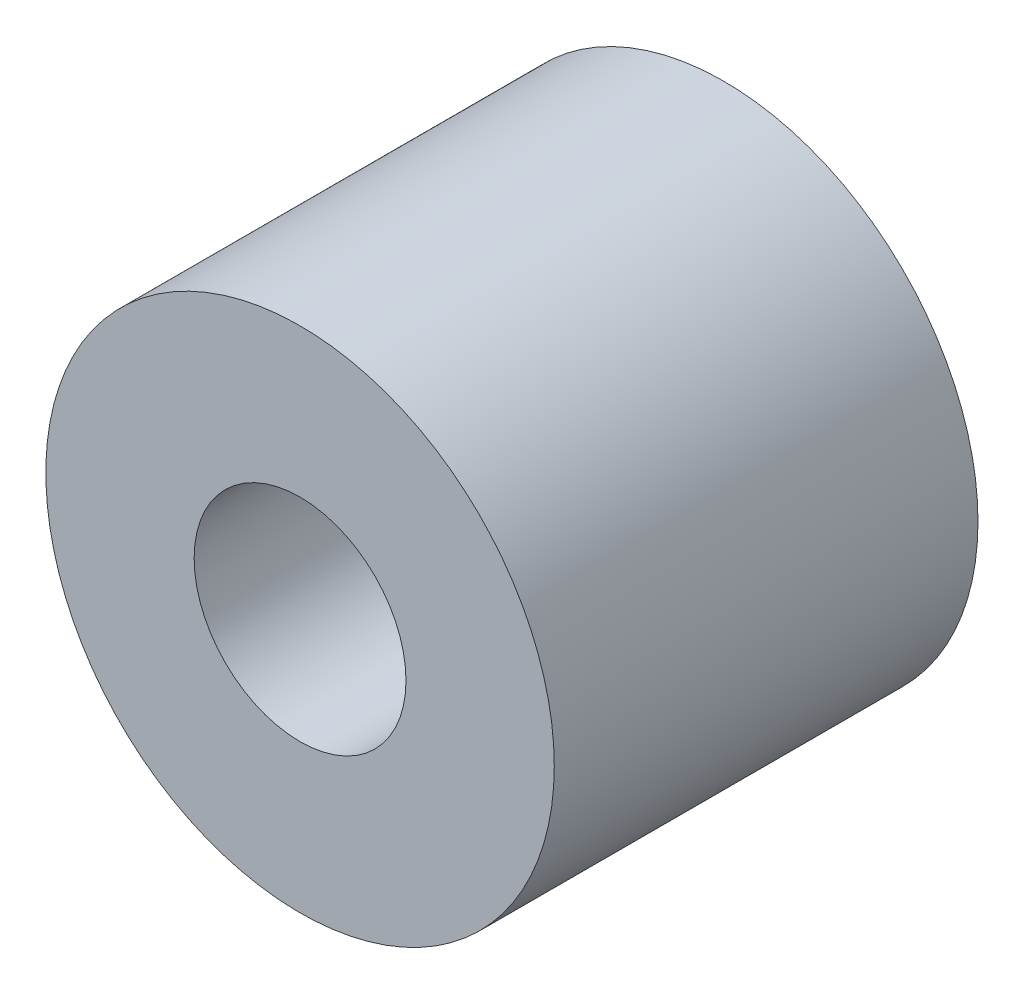
ISO-10303-21;
HEADER;
FILE_DESCRIPTION(('STEP AP214'),'2;1');
FILE_NAME('part.step','',(''),(''),'','','');
FILE_SCHEMA(('AUTOMOTIVE_DESIGN { 1 0 10303 214 1 1 1 1 }'));
ENDSEC;
DATA;
#1=APPLICATION_CONTEXT('core data for automotive mechanical design processes');
#2=APPLICATION_PROTOCOL_DEFINITION('international standard','automotive_design',2000,#1);
#3=PRODUCT_CONTEXT('',#1,'mechanical');
#4=PRODUCT('Part','Part','',(#3));
#5=PRODUCT_RELATED_PRODUCT_CATEGORY('part','',(#4));
#6=PRODUCT_DEFINITION_FORMATION('','',#4);
#7=PRODUCT_DEFINITION_CONTEXT('part definition',#1,'design');
#8=PRODUCT_DEFINITION('design','',#6,#7);
#9=PRODUCT_DEFINITION_SHAPE('','',#8);
#10=(LENGTH_UNIT() NAMED_UNIT(*) SI_UNIT(.MILLI.,.METRE.));
#11=(NAMED_UNIT(*) PLANE_ANGLE_UNIT() SI_UNIT($,.RADIAN.));
#12=(NAMED_UNIT(*) SI_UNIT($,.STERADIAN.) SOLID_ANGLE_UNIT());
#13=UNCERTAINTY_MEASURE_WITH_UNIT(LENGTH_MEASURE(1.E-05),#10,'distance_accuracy_value','');
#14=(GEOMETRIC_REPRESENTATION_CONTEXT(3) GLOBAL_UNCERTAINTY_ASSIGNED_CONTEXT((#13)) GLOBAL_UNIT_ASSIGNED_CONTEXT((#10,
#11,#12)) REPRESENTATION_CONTEXT('',''));
#15=CARTESIAN_POINT('',(0.,0.,0.));
#16=DIRECTION('',(0.,0.,1.));
#17=DIRECTION('',(1.,0.,0.));
#18=AXIS2_PLACEMENT_3D('',#15,#16,#17);
#19=CARTESIAN_POINT('',(0.,0.,5.));
#20=DIRECTION('',(0.,0.,1.));
#21=DIRECTION('',(1.,0.,0.));
#22=AXIS2_PLACEMENT_3D('',#19,#20,#21);
#23=PLANE('',#22);
#24=CARTESIAN_POINT('',(0.,0.,5.));
#25=DIRECTION('',(0.,0.,1.));
#26=DIRECTION('',(1.,0.,0.));
#27=AXIS2_PLACEMENT_3D('',#24,#25,#26);
#28=CIRCLE('',#27,3.);
#29=CARTESIAN_POINT('',(3.,0.,5.));
#30=VERTEX_POINT('',#29);
#31=EDGE_CURVE('E10',#30,#30,#28,.T.);
#32=ORIENTED_EDGE('',*,*,#31,.T.);
#33=EDGE_LOOP('',(#32));
#34=FACE_BOUND('',#33,.T.);
#35=CARTESIAN_POINT('',(0.,0.,5.));
#36=DIRECTION('',(0.,0.,1.));
#37=DIRECTION('',(1.,0.,0.));
#38=AXIS2_PLACEMENT_3D('',#35,#36,#37);
#39=CIRCLE('',#38,1.25);
#40=CARTESIAN_POINT('',(1.25,0.,5.));
#41=VERTEX_POINT('',#40);
#42=EDGE_CURVE('E42',#41,#41,#39,.T.);
#43=ORIENTED_EDGE('',*,*,#42,.F.);
#44=EDGE_LOOP('',(#43));
#45=FACE_BOUND('',#44,.T.);
#46=ADVANCED_FACE('F31',(#34,#45),#23,.T.);
#47=CARTESIAN_POINT('',(0.,0.,0.));
#48=DIRECTION('',(0.,0.,1.));
#49=DIRECTION('',(1.,0.,0.));
#50=AXIS2_PLACEMENT_3D('',#47,#48,#49);
#51=PLANE('',#50);
#52=CARTESIAN_POINT('',(0.,0.,0.));
#53=DIRECTION('',(0.,0.,1.));
#54=DIRECTION('',(1.,0.,0.));
#55=AXIS2_PLACEMENT_3D('',#52,#53,#54);
#56=CIRCLE('',#55,3.);
#57=CARTESIAN_POINT('',(3.,0.,0.));
#58=VERTEX_POINT('',#57);
#59=EDGE_CURVE('E35',#58,#58,#56,.T.);
#60=ORIENTED_EDGE('',*,*,#59,.F.);
#61=EDGE_LOOP('',(#60));
#62=FACE_BOUND('',#61,.T.);
#63=CARTESIAN_POINT('',(0.,0.,0.));
#64=DIRECTION('',(0.,0.,1.));
#65=DIRECTION('',(1.,0.,0.));
#66=AXIS2_PLACEMENT_3D('',#63,#64,#65);
#67=CIRCLE('',#66,1.25);
#68=CARTESIAN_POINT('',(1.25,0.,0.));
#69=VERTEX_POINT('',#68);
#70=EDGE_CURVE('E44',#69,#69,#67,.T.);
#71=ORIENTED_EDGE('',*,*,#70,.T.);
#72=EDGE_LOOP('',(#71));
#73=FACE_BOUND('',#72,.T.);
#74=ADVANCED_FACE('F54',(#62,#73),#51,.F.);
#75=CARTESIAN_POINT('',(0.,0.,5.));
#76=DIRECTION('',(0.,0.,-1.));
#77=DIRECTION('',(-1.,0.,0.));
#78=AXIS2_PLACEMENT_3D('',#75,#76,#77);
#79=CYLINDRICAL_SURFACE('',#78,3.);
#80=ORIENTED_EDGE('',*,*,#31,.F.);
#81=EDGE_LOOP('',(#80));
#82=FACE_BOUND('',#81,.T.);
#83=ORIENTED_EDGE('',*,*,#59,.T.);
#84=EDGE_LOOP('',(#83));
#85=FACE_BOUND('',#84,.T.);
#86=ADVANCED_FACE('F33',(#82,#85),#79,.T.);
#87=CARTESIAN_POINT('',(0.,0.,5.));
#88=DIRECTION('',(0.,0.,-1.));
#89=DIRECTION('',(-1.,0.,0.));
#90=AXIS2_PLACEMENT_3D('',#87,#88,#89);
#91=CYLINDRICAL_SURFACE('',#90,1.25);
#92=ORIENTED_EDGE('',*,*,#42,.T.);
#93=EDGE_LOOP('',(#92));
#94=FACE_BOUND('',#93,.T.);
#95=ORIENTED_EDGE('',*,*,#70,.F.);
#96=EDGE_LOOP('',(#95));
#97=FACE_BOUND('',#96,.T.);
#98=ADVANCED_FACE('F50',(#94,#97),#91,.F.);
#99=CLOSED_SHELL('',(#46,#74,#86,#98));
#100=MANIFOLD_SOLID_BREP('B2',#99);
#101=ADVANCED_BREP_SHAPE_REPRESENTATION('',(#18,#100),#14);
#102=SHAPE_DEFINITION_REPRESENTATION(#9,#101);
ENDSEC;
END-ISO-10303-21;
